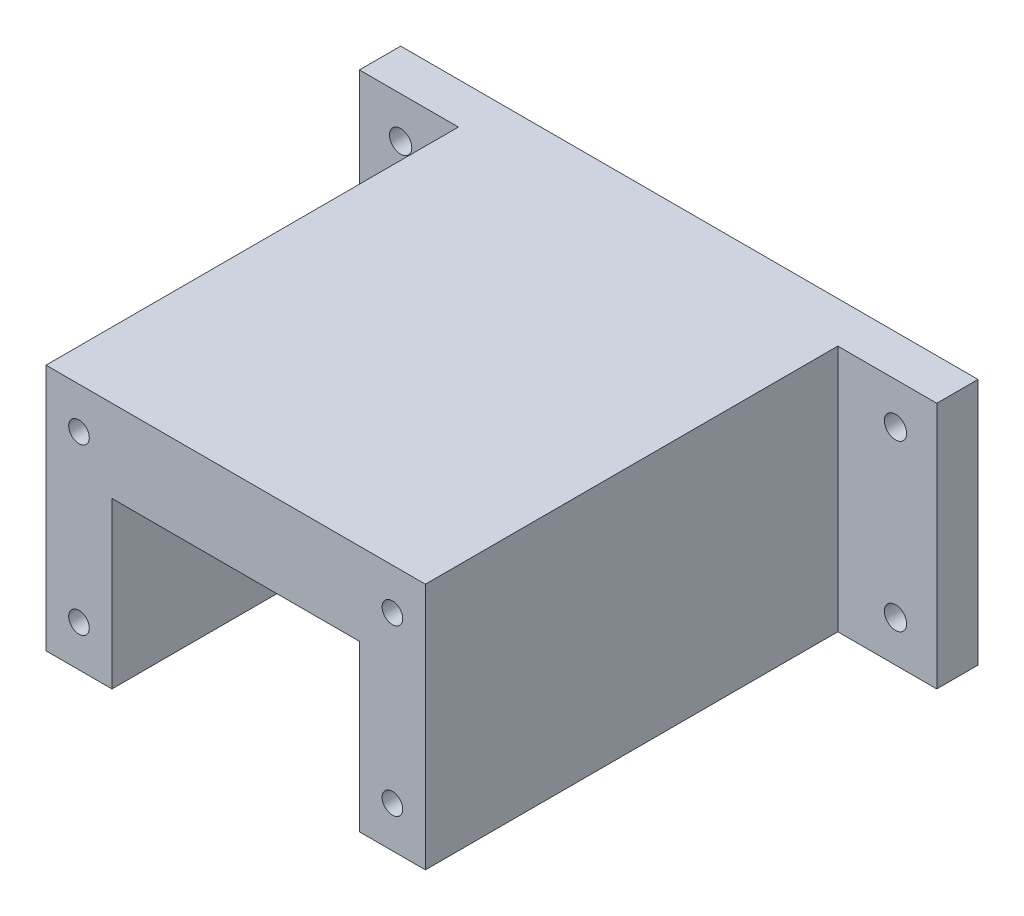
ISO-10303-21;
HEADER;
FILE_DESCRIPTION(('STEP AP214'),'2;1');
FILE_NAME('part.step','',(''),(''),'','','');
FILE_SCHEMA(('AUTOMOTIVE_DESIGN { 1 0 10303 214 1 1 1 1 }'));
ENDSEC;
DATA;
#1=APPLICATION_CONTEXT('core data for automotive mechanical design processes');
#2=APPLICATION_PROTOCOL_DEFINITION('international standard','automotive_design',2000,#1);
#3=PRODUCT_CONTEXT('',#1,'mechanical');
#4=PRODUCT('Part','Part','',(#3));
#5=PRODUCT_RELATED_PRODUCT_CATEGORY('part','',(#4));
#6=PRODUCT_DEFINITION_FORMATION('','',#4);
#7=PRODUCT_DEFINITION_CONTEXT('part definition',#1,'design');
#8=PRODUCT_DEFINITION('design','',#6,#7);
#9=PRODUCT_DEFINITION_SHAPE('','',#8);
#10=(LENGTH_UNIT() NAMED_UNIT(*) SI_UNIT(.MILLI.,.METRE.));
#11=(NAMED_UNIT(*) PLANE_ANGLE_UNIT() SI_UNIT($,.RADIAN.));
#12=(NAMED_UNIT(*) SI_UNIT($,.STERADIAN.) SOLID_ANGLE_UNIT());
#13=UNCERTAINTY_MEASURE_WITH_UNIT(LENGTH_MEASURE(1.E-05),#10,'distance_accuracy_value','');
#14=(GEOMETRIC_REPRESENTATION_CONTEXT(3) GLOBAL_UNCERTAINTY_ASSIGNED_CONTEXT((#13)) GLOBAL_UNIT_ASSIGNED_CONTEXT((#10,
#11,#12)) REPRESENTATION_CONTEXT('',''));
#15=CARTESIAN_POINT('',(0.,0.,0.));
#16=DIRECTION('',(0.,0.,1.));
#17=DIRECTION('',(1.,0.,0.));
#18=AXIS2_PLACEMENT_3D('',#15,#16,#17);
#19=CARTESIAN_POINT('',(0.,0.,5.));
#20=DIRECTION('',(0.,0.,-1.));
#21=DIRECTION('',(-1.,0.,0.));
#22=AXIS2_PLACEMENT_3D('',#19,#20,#21);
#23=PLANE('',#22);
#24=CARTESIAN_POINT('',(5.,5.,5.));
#25=DIRECTION('',(0.,0.,1.));
#26=DIRECTION('',(1.,0.,0.));
#27=AXIS2_PLACEMENT_3D('',#24,#25,#26);
#28=CIRCLE('',#27,1.35);
#29=CARTESIAN_POINT('',(6.35,5.,5.));
#30=VERTEX_POINT('',#29);
#31=EDGE_CURVE('E176',#30,#30,#28,.T.);
#32=ORIENTED_EDGE('',*,*,#31,.F.);
#33=EDGE_LOOP('',(#32));
#34=FACE_BOUND('',#33,.T.);
#35=CARTESIAN_POINT('',(5.,25.,5.));
#36=DIRECTION('',(0.,0.,1.));
#37=DIRECTION('',(1.,0.,0.));
#38=AXIS2_PLACEMENT_3D('',#35,#36,#37);
#39=CIRCLE('',#38,1.35);
#40=CARTESIAN_POINT('',(6.35,25.,5.));
#41=VERTEX_POINT('',#40);
#42=EDGE_CURVE('E182',#41,#41,#39,.T.);
#43=ORIENTED_EDGE('',*,*,#42,.F.);
#44=EDGE_LOOP('',(#43));
#45=FACE_BOUND('',#44,.T.);
#46=DIRECTION('',(0.,-1.,0.));
#47=VECTOR('',#46,1.);
#48=CARTESIAN_POINT('',(12.,0.,5.));
#49=LINE('',#48,#47);
#50=CARTESIAN_POINT('',(12.,30.,5.));
#51=VERTEX_POINT('',#50);
#52=CARTESIAN_POINT('',(12.,0.,5.));
#53=VERTEX_POINT('',#52);
#54=EDGE_CURVE('E153',#51,#53,#49,.T.);
#55=ORIENTED_EDGE('',*,*,#54,.F.);
#56=DIRECTION('',(-1.,0.,0.));
#57=VECTOR('',#56,1.);
#58=CARTESIAN_POINT('',(0.,30.,5.));
#59=LINE('',#58,#57);
#60=CARTESIAN_POINT('',(0.,30.,5.));
#61=VERTEX_POINT('',#60);
#62=EDGE_CURVE('E200',#51,#61,#59,.T.);
#63=ORIENTED_EDGE('',*,*,#62,.T.);
#64=DIRECTION('',(0.,-1.,0.));
#65=VECTOR('',#64,1.);
#66=CARTESIAN_POINT('',(0.,0.,5.));
#67=LINE('',#66,#65);
#68=CARTESIAN_POINT('',(0.,0.,5.));
#69=VERTEX_POINT('',#68);
#70=EDGE_CURVE('E188',#61,#69,#67,.T.);
#71=ORIENTED_EDGE('',*,*,#70,.T.);
#72=DIRECTION('',(1.,0.,0.));
#73=VECTOR('',#72,1.);
#74=CARTESIAN_POINT('',(0.,0.,5.));
#75=LINE('',#74,#73);
#76=EDGE_CURVE('E191',#69,#53,#75,.T.);
#77=ORIENTED_EDGE('',*,*,#76,.T.);
#78=EDGE_LOOP('',(#55,#63,#71,#77));
#79=FACE_BOUND('',#78,.T.);
#80=ADVANCED_FACE('F34',(#34,#45,#79),#23,.F.);
#81=CARTESIAN_POINT('',(65.,5.,5.));
#82=DIRECTION('',(0.,0.,1.));
#83=DIRECTION('',(1.,0.,0.));
#84=AXIS2_PLACEMENT_3D('',#81,#82,#83);
#85=CIRCLE('',#84,1.35000000000001);
#86=CARTESIAN_POINT('',(66.35,5.,5.));
#87=VERTEX_POINT('',#86);
#88=EDGE_CURVE('E160',#87,#87,#85,.T.);
#89=ORIENTED_EDGE('',*,*,#88,.F.);
#90=EDGE_LOOP('',(#89));
#91=FACE_BOUND('',#90,.T.);
#92=CARTESIAN_POINT('',(65.,25.,5.));
#93=DIRECTION('',(0.,0.,1.));
#94=DIRECTION('',(1.,0.,0.));
#95=AXIS2_PLACEMENT_3D('',#92,#93,#94);
#96=CIRCLE('',#95,1.35000000000001);
#97=CARTESIAN_POINT('',(66.35,25.,5.));
#98=VERTEX_POINT('',#97);
#99=EDGE_CURVE('E170',#98,#98,#96,.T.);
#100=ORIENTED_EDGE('',*,*,#99,.F.);
#101=EDGE_LOOP('',(#100));
#102=FACE_BOUND('',#101,.T.);
#103=DIRECTION('',(0.,1.,0.));
#104=VECTOR('',#103,1.);
#105=CARTESIAN_POINT('',(58.,30.,5.));
#106=LINE('',#105,#104);
#107=CARTESIAN_POINT('',(58.,0.,5.));
#108=VERTEX_POINT('',#107);
#109=CARTESIAN_POINT('',(58.,30.,5.));
#110=VERTEX_POINT('',#109);
#111=EDGE_CURVE('E283',#108,#110,#106,.T.);
#112=ORIENTED_EDGE('',*,*,#111,.F.);
#113=DIRECTION('',(1.,0.,0.));
#114=VECTOR('',#113,1.);
#115=CARTESIAN_POINT('',(50.,0.,5.));
#116=LINE('',#115,#114);
#117=CARTESIAN_POINT('',(70.,0.,5.));
#118=VERTEX_POINT('',#117);
#119=EDGE_CURVE('E196',#108,#118,#116,.T.);
#120=ORIENTED_EDGE('',*,*,#119,.T.);
#121=DIRECTION('',(0.,1.,0.));
#122=VECTOR('',#121,1.);
#123=CARTESIAN_POINT('',(70.,0.,5.));
#124=LINE('',#123,#122);
#125=CARTESIAN_POINT('',(70.,30.,5.));
#126=VERTEX_POINT('',#125);
#127=EDGE_CURVE('E198',#118,#126,#124,.T.);
#128=ORIENTED_EDGE('',*,*,#127,.T.);
#129=EDGE_CURVE('E201',#126,#110,#59,.T.);
#130=ORIENTED_EDGE('',*,*,#129,.T.);
#131=EDGE_LOOP('',(#112,#120,#128,#130));
#132=FACE_BOUND('',#131,.T.);
#133=ADVANCED_FACE('F335',(#91,#102,#132),#23,.F.);
#134=DIRECTION('',(0.,1.,0.));
#135=VECTOR('',#134,1.);
#136=CARTESIAN_POINT('',(20.,20.,5.));
#137=LINE('',#136,#135);
#138=CARTESIAN_POINT('',(20.,10.,5.));
#139=VERTEX_POINT('',#138);
#140=CARTESIAN_POINT('',(20.,20.,5.));
#141=VERTEX_POINT('',#140);
#142=EDGE_CURVE('E11',#139,#141,#137,.T.);
#143=ORIENTED_EDGE('',*,*,#142,.F.);
#144=DIRECTION('',(1.,0.,0.));
#145=VECTOR('',#144,1.);
#146=CARTESIAN_POINT('',(20.,10.,5.));
#147=LINE('',#146,#145);
#148=CARTESIAN_POINT('',(50.,10.,5.));
#149=VERTEX_POINT('',#148);
#150=EDGE_CURVE('E194',#139,#149,#147,.T.);
#151=ORIENTED_EDGE('',*,*,#150,.T.);
#152=DIRECTION('',(0.,-1.,0.));
#153=VECTOR('',#152,1.);
#154=CARTESIAN_POINT('',(50.,0.,5.));
#155=LINE('',#154,#153);
#156=CARTESIAN_POINT('',(50.,20.,5.));
#157=VERTEX_POINT('',#156);
#158=EDGE_CURVE('E54',#157,#149,#155,.T.);
#159=ORIENTED_EDGE('',*,*,#158,.F.);
#160=DIRECTION('',(1.,0.,0.));
#161=VECTOR('',#160,1.);
#162=CARTESIAN_POINT('',(50.,20.,5.));
#163=LINE('',#162,#161);
#164=EDGE_CURVE('E50',#141,#157,#163,.T.);
#165=ORIENTED_EDGE('',*,*,#164,.F.);
#166=EDGE_LOOP('',(#143,#151,#159,#165));
#167=FACE_BOUND('',#166,.T.);
#168=ADVANCED_FACE('F259',(#167),#23,.F.);
#169=CARTESIAN_POINT('',(0.,0.,0.));
#170=DIRECTION('',(0.,0.,-1.));
#171=DIRECTION('',(-1.,0.,0.));
#172=AXIS2_PLACEMENT_3D('',#169,#170,#171);
#173=PLANE('',#172);
#174=CARTESIAN_POINT('',(65.,25.,0.));
#175=DIRECTION('',(0.,0.,1.));
#176=DIRECTION('',(1.,0.,0.));
#177=AXIS2_PLACEMENT_3D('',#174,#175,#176);
#178=CIRCLE('',#177,1.35000000000001);
#179=CARTESIAN_POINT('',(66.35,25.,0.));
#180=VERTEX_POINT('',#179);
#181=EDGE_CURVE('E168',#180,#180,#178,.T.);
#182=ORIENTED_EDGE('',*,*,#181,.T.);
#183=EDGE_LOOP('',(#182));
#184=FACE_BOUND('',#183,.T.);
#185=CARTESIAN_POINT('',(5.,25.,0.));
#186=DIRECTION('',(0.,0.,1.));
#187=DIRECTION('',(1.,0.,0.));
#188=AXIS2_PLACEMENT_3D('',#185,#186,#187);
#189=CIRCLE('',#188,1.35);
#190=CARTESIAN_POINT('',(6.35,25.,0.));
#191=VERTEX_POINT('',#190);
#192=EDGE_CURVE('E179',#191,#191,#189,.T.);
#193=ORIENTED_EDGE('',*,*,#192,.T.);
#194=EDGE_LOOP('',(#193));
#195=FACE_BOUND('',#194,.T.);
#196=DIRECTION('',(0.,-1.,0.));
#197=VECTOR('',#196,1.);
#198=CARTESIAN_POINT('',(0.,0.,0.));
#199=LINE('',#198,#197);
#200=CARTESIAN_POINT('',(0.,30.,0.));
#201=VERTEX_POINT('',#200);
#202=CARTESIAN_POINT('',(0.,0.,0.));
#203=VERTEX_POINT('',#202);
#204=EDGE_CURVE('E185',#201,#203,#199,.T.);
#205=ORIENTED_EDGE('',*,*,#204,.F.);
#206=DIRECTION('',(-1.,0.,0.));
#207=VECTOR('',#206,1.);
#208=CARTESIAN_POINT('',(0.,30.,0.));
#209=LINE('',#208,#207);
#210=CARTESIAN_POINT('',(70.,30.,0.));
#211=VERTEX_POINT('',#210);
#212=EDGE_CURVE('E192',#211,#201,#209,.T.);
#213=ORIENTED_EDGE('',*,*,#212,.F.);
#214=DIRECTION('',(0.,1.,0.));
#215=VECTOR('',#214,1.);
#216=CARTESIAN_POINT('',(70.,0.,0.));
#217=LINE('',#216,#215);
#218=CARTESIAN_POINT('',(70.,0.,0.));
#219=VERTEX_POINT('',#218);
#220=EDGE_CURVE('E216',#219,#211,#217,.T.);
#221=ORIENTED_EDGE('',*,*,#220,.F.);
#222=DIRECTION('',(1.,0.,0.));
#223=VECTOR('',#222,1.);
#224=CARTESIAN_POINT('',(50.,0.,0.));
#225=LINE('',#224,#223);
#226=CARTESIAN_POINT('',(50.,0.,0.));
#227=VERTEX_POINT('',#226);
#228=EDGE_CURVE('E214',#227,#219,#225,.T.);
#229=ORIENTED_EDGE('',*,*,#228,.F.);
#230=DIRECTION('',(0.,-1.,0.));
#231=VECTOR('',#230,1.);
#232=CARTESIAN_POINT('',(50.,10.,0.));
#233=LINE('',#232,#231);
#234=CARTESIAN_POINT('',(50.,10.,0.));
#235=VERTEX_POINT('',#234);
#236=EDGE_CURVE('E212',#235,#227,#233,.T.);
#237=ORIENTED_EDGE('',*,*,#236,.F.);
#238=DIRECTION('',(1.,0.,0.));
#239=VECTOR('',#238,1.);
#240=CARTESIAN_POINT('',(20.,10.,0.));
#241=LINE('',#240,#239);
#242=CARTESIAN_POINT('',(20.,10.,0.));
#243=VERTEX_POINT('',#242);
#244=EDGE_CURVE('E210',#243,#235,#241,.T.);
#245=ORIENTED_EDGE('',*,*,#244,.F.);
#246=DIRECTION('',(0.,1.,0.));
#247=VECTOR('',#246,1.);
#248=CARTESIAN_POINT('',(20.,0.,0.));
#249=LINE('',#248,#247);
#250=CARTESIAN_POINT('',(20.,0.,0.));
#251=VERTEX_POINT('',#250);
#252=EDGE_CURVE('E208',#251,#243,#249,.T.);
#253=ORIENTED_EDGE('',*,*,#252,.F.);
#254=DIRECTION('',(1.,0.,0.));
#255=VECTOR('',#254,1.);
#256=CARTESIAN_POINT('',(0.,0.,0.));
#257=LINE('',#256,#255);
#258=EDGE_CURVE('E206',#203,#251,#257,.T.);
#259=ORIENTED_EDGE('',*,*,#258,.F.);
#260=EDGE_LOOP('',(#205,#213,#221,#229,#237,#245,#253,#259));
#261=FACE_BOUND('',#260,.T.);
#262=CARTESIAN_POINT('',(5.,5.,0.));
#263=DIRECTION('',(0.,0.,1.));
#264=DIRECTION('',(1.,0.,0.));
#265=AXIS2_PLACEMENT_3D('',#262,#263,#264);
#266=CIRCLE('',#265,1.35);
#267=CARTESIAN_POINT('',(6.35,5.,0.));
#268=VERTEX_POINT('',#267);
#269=EDGE_CURVE('E173',#268,#268,#266,.T.);
#270=ORIENTED_EDGE('',*,*,#269,.T.);
#271=EDGE_LOOP('',(#270));
#272=FACE_BOUND('',#271,.T.);
#273=CARTESIAN_POINT('',(65.,5.,0.));
#274=DIRECTION('',(0.,0.,1.));
#275=DIRECTION('',(1.,0.,0.));
#276=AXIS2_PLACEMENT_3D('',#273,#274,#275);
#277=CIRCLE('',#276,1.35000000000001);
#278=CARTESIAN_POINT('',(66.35,5.,0.));
#279=VERTEX_POINT('',#278);
#280=EDGE_CURVE('E156',#279,#279,#277,.T.);
#281=ORIENTED_EDGE('',*,*,#280,.T.);
#282=EDGE_LOOP('',(#281));
#283=FACE_BOUND('',#282,.T.);
#284=ADVANCED_FACE('F248',(#184,#195,#261,#272,#283),#173,.T.);
#285=CARTESIAN_POINT('',(0.,0.,5.));
#286=DIRECTION('',(1.,0.,0.));
#287=DIRECTION('',(0.,0.,-1.));
#288=AXIS2_PLACEMENT_3D('',#285,#286,#287);
#289=PLANE('',#288);
#290=ORIENTED_EDGE('',*,*,#204,.T.);
#291=DIRECTION('',(0.,0.,-1.));
#292=VECTOR('',#291,1.);
#293=CARTESIAN_POINT('',(0.,0.,5.));
#294=LINE('',#293,#292);
#295=EDGE_CURVE('E38',#69,#203,#294,.T.);
#296=ORIENTED_EDGE('',*,*,#295,.F.);
#297=ORIENTED_EDGE('',*,*,#70,.F.);
#298=DIRECTION('',(0.,0.,-1.));
#299=VECTOR('',#298,1.);
#300=CARTESIAN_POINT('',(0.,30.,5.));
#301=LINE('',#300,#299);
#302=EDGE_CURVE('E203',#61,#201,#301,.T.);
#303=ORIENTED_EDGE('',*,*,#302,.T.);
#304=EDGE_LOOP('',(#290,#296,#297,#303));
#305=FACE_BOUND('',#304,.T.);
#306=ADVANCED_FACE('F36',(#305),#289,.F.);
#307=CARTESIAN_POINT('',(0.,0.,5.));
#308=DIRECTION('',(0.,1.,0.));
#309=DIRECTION('',(0.,0.,1.));
#310=AXIS2_PLACEMENT_3D('',#307,#308,#309);
#311=PLANE('',#310);
#312=ORIENTED_EDGE('',*,*,#258,.T.);
#313=DIRECTION('',(0.,0.,-1.));
#314=VECTOR('',#313,1.);
#315=CARTESIAN_POINT('',(20.,0.,5.));
#316=LINE('',#315,#314);
#317=CARTESIAN_POINT('',(20.,0.,55.));
#318=VERTEX_POINT('',#317);
#319=EDGE_CURVE('E233',#318,#251,#316,.T.);
#320=ORIENTED_EDGE('',*,*,#319,.F.);
#321=DIRECTION('',(1.,0.,0.));
#322=VECTOR('',#321,1.);
#323=CARTESIAN_POINT('',(20.,0.,55.));
#324=LINE('',#323,#322);
#325=CARTESIAN_POINT('',(12.,0.,55.));
#326=VERTEX_POINT('',#325);
#327=EDGE_CURVE('E265',#326,#318,#324,.T.);
#328=ORIENTED_EDGE('',*,*,#327,.F.);
#329=DIRECTION('',(0.,0.,-1.));
#330=VECTOR('',#329,1.);
#331=CARTESIAN_POINT('',(12.,0.,55.));
#332=LINE('',#331,#330);
#333=EDGE_CURVE('E261',#326,#53,#332,.T.);
#334=ORIENTED_EDGE('',*,*,#333,.T.);
#335=ORIENTED_EDGE('',*,*,#76,.F.);
#336=ORIENTED_EDGE('',*,*,#295,.T.);
#337=EDGE_LOOP('',(#312,#320,#328,#334,#335,#336));
#338=FACE_BOUND('',#337,.T.);
#339=ADVANCED_FACE('F240',(#338),#311,.F.);
#340=CARTESIAN_POINT('',(20.,0.,5.));
#341=DIRECTION('',(-1.,0.,0.));
#342=DIRECTION('',(0.,-1.,0.));
#343=AXIS2_PLACEMENT_3D('',#340,#341,#342);
#344=PLANE('',#343);
#345=ORIENTED_EDGE('',*,*,#252,.T.);
#346=DIRECTION('',(0.,0.,-1.));
#347=VECTOR('',#346,1.);
#348=CARTESIAN_POINT('',(20.,10.,5.));
#349=LINE('',#348,#347);
#350=EDGE_CURVE('E231',#139,#243,#349,.T.);
#351=ORIENTED_EDGE('',*,*,#350,.F.);
#352=ORIENTED_EDGE('',*,*,#142,.T.);
#353=DIRECTION('',(0.,0.,-1.));
#354=VECTOR('',#353,1.);
#355=CARTESIAN_POINT('',(20.,20.,55.));
#356=LINE('',#355,#354);
#357=CARTESIAN_POINT('',(20.,20.,55.));
#358=VERTEX_POINT('',#357);
#359=EDGE_CURVE('E260',#358,#141,#356,.T.);
#360=ORIENTED_EDGE('',*,*,#359,.F.);
#361=DIRECTION('',(0.,1.,0.));
#362=VECTOR('',#361,1.);
#363=CARTESIAN_POINT('',(20.,20.,55.));
#364=LINE('',#363,#362);
#365=EDGE_CURVE('E149',#318,#358,#364,.T.);
#366=ORIENTED_EDGE('',*,*,#365,.F.);
#367=ORIENTED_EDGE('',*,*,#319,.T.);
#368=EDGE_LOOP('',(#345,#351,#352,#360,#366,#367));
#369=FACE_BOUND('',#368,.T.);
#370=ADVANCED_FACE('F254',(#369),#344,.F.);
#371=CARTESIAN_POINT('',(20.,10.,5.));
#372=DIRECTION('',(0.,1.,0.));
#373=DIRECTION('',(0.,0.,1.));
#374=AXIS2_PLACEMENT_3D('',#371,#372,#373);
#375=PLANE('',#374);
#376=ORIENTED_EDGE('',*,*,#244,.T.);
#377=DIRECTION('',(0.,0.,-1.));
#378=VECTOR('',#377,1.);
#379=CARTESIAN_POINT('',(50.,10.,5.));
#380=LINE('',#379,#378);
#381=EDGE_CURVE('E228',#149,#235,#380,.T.);
#382=ORIENTED_EDGE('',*,*,#381,.F.);
#383=ORIENTED_EDGE('',*,*,#150,.F.);
#384=ORIENTED_EDGE('',*,*,#350,.T.);
#385=EDGE_LOOP('',(#376,#382,#383,#384));
#386=FACE_BOUND('',#385,.T.);
#387=ADVANCED_FACE('F257',(#386),#375,.F.);
#388=CARTESIAN_POINT('',(50.,10.,5.));
#389=DIRECTION('',(1.,0.,0.));
#390=DIRECTION('',(0.,0.,-1.));
#391=AXIS2_PLACEMENT_3D('',#388,#389,#390);
#392=PLANE('',#391);
#393=ORIENTED_EDGE('',*,*,#236,.T.);
#394=DIRECTION('',(0.,0.,-1.));
#395=VECTOR('',#394,1.);
#396=CARTESIAN_POINT('',(50.,0.,5.));
#397=LINE('',#396,#395);
#398=CARTESIAN_POINT('',(50.,0.,55.));
#399=VERTEX_POINT('',#398);
#400=EDGE_CURVE('E139',#399,#227,#397,.T.);
#401=ORIENTED_EDGE('',*,*,#400,.F.);
#402=DIRECTION('',(0.,-1.,0.));
#403=VECTOR('',#402,1.);
#404=CARTESIAN_POINT('',(50.,0.,55.));
#405=LINE('',#404,#403);
#406=CARTESIAN_POINT('',(50.,20.,55.));
#407=VERTEX_POINT('',#406);
#408=EDGE_CURVE('E133',#407,#399,#405,.T.);
#409=ORIENTED_EDGE('',*,*,#408,.F.);
#410=DIRECTION('',(0.,0.,-1.));
#411=VECTOR('',#410,1.);
#412=CARTESIAN_POINT('',(50.,20.,55.));
#413=LINE('',#412,#411);
#414=EDGE_CURVE('E137',#407,#157,#413,.T.);
#415=ORIENTED_EDGE('',*,*,#414,.T.);
#416=ORIENTED_EDGE('',*,*,#158,.T.);
#417=ORIENTED_EDGE('',*,*,#381,.T.);
#418=EDGE_LOOP('',(#393,#401,#409,#415,#416,#417));
#419=FACE_BOUND('',#418,.T.);
#420=ADVANCED_FACE('F135',(#419),#392,.F.);
#421=CARTESIAN_POINT('',(50.,0.,5.));
#422=DIRECTION('',(0.,1.,0.));
#423=DIRECTION('',(0.,0.,1.));
#424=AXIS2_PLACEMENT_3D('',#421,#422,#423);
#425=PLANE('',#424);
#426=ORIENTED_EDGE('',*,*,#228,.T.);
#427=DIRECTION('',(0.,0.,-1.));
#428=VECTOR('',#427,1.);
#429=CARTESIAN_POINT('',(70.,0.,5.));
#430=LINE('',#429,#428);
#431=EDGE_CURVE('E224',#118,#219,#430,.T.);
#432=ORIENTED_EDGE('',*,*,#431,.F.);
#433=ORIENTED_EDGE('',*,*,#119,.F.);
#434=DIRECTION('',(0.,0.,-1.));
#435=VECTOR('',#434,1.);
#436=CARTESIAN_POINT('',(58.,0.,55.));
#437=LINE('',#436,#435);
#438=CARTESIAN_POINT('',(58.,0.,55.));
#439=VERTEX_POINT('',#438);
#440=EDGE_CURVE('E157',#439,#108,#437,.T.);
#441=ORIENTED_EDGE('',*,*,#440,.F.);
#442=DIRECTION('',(1.,0.,0.));
#443=VECTOR('',#442,1.);
#444=CARTESIAN_POINT('',(58.,0.,55.));
#445=LINE('',#444,#443);
#446=EDGE_CURVE('E142',#399,#439,#445,.T.);
#447=ORIENTED_EDGE('',*,*,#446,.F.);
#448=ORIENTED_EDGE('',*,*,#400,.T.);
#449=EDGE_LOOP('',(#426,#432,#433,#441,#447,#448));
#450=FACE_BOUND('',#449,.T.);
#451=ADVANCED_FACE('F362',(#450),#425,.F.);
#452=CARTESIAN_POINT('',(70.,0.,5.));
#453=DIRECTION('',(-1.,0.,0.));
#454=DIRECTION('',(0.,0.,1.));
#455=AXIS2_PLACEMENT_3D('',#452,#453,#454);
#456=PLANE('',#455);
#457=ORIENTED_EDGE('',*,*,#220,.T.);
#458=DIRECTION('',(0.,0.,-1.));
#459=VECTOR('',#458,1.);
#460=CARTESIAN_POINT('',(70.,30.,5.));
#461=LINE('',#460,#459);
#462=EDGE_CURVE('E221',#126,#211,#461,.T.);
#463=ORIENTED_EDGE('',*,*,#462,.F.);
#464=ORIENTED_EDGE('',*,*,#127,.F.);
#465=ORIENTED_EDGE('',*,*,#431,.T.);
#466=EDGE_LOOP('',(#457,#463,#464,#465));
#467=FACE_BOUND('',#466,.T.);
#468=ADVANCED_FACE('F359',(#467),#456,.F.);
#469=CARTESIAN_POINT('',(0.,30.,5.));
#470=DIRECTION('',(0.,-1.,0.));
#471=DIRECTION('',(0.,0.,-1.));
#472=AXIS2_PLACEMENT_3D('',#469,#470,#471);
#473=PLANE('',#472);
#474=ORIENTED_EDGE('',*,*,#212,.T.);
#475=ORIENTED_EDGE('',*,*,#302,.F.);
#476=ORIENTED_EDGE('',*,*,#62,.F.);
#477=DIRECTION('',(0.,0.,-1.));
#478=VECTOR('',#477,1.);
#479=CARTESIAN_POINT('',(12.,30.,55.));
#480=LINE('',#479,#478);
#481=CARTESIAN_POINT('',(12.,30.,55.));
#482=VERTEX_POINT('',#481);
#483=EDGE_CURVE('E263',#482,#51,#480,.T.);
#484=ORIENTED_EDGE('',*,*,#483,.F.);
#485=DIRECTION('',(-1.,0.,0.));
#486=VECTOR('',#485,1.);
#487=CARTESIAN_POINT('',(12.,30.,55.));
#488=LINE('',#487,#486);
#489=CARTESIAN_POINT('',(58.,30.,55.));
#490=VERTEX_POINT('',#489);
#491=EDGE_CURVE('E277',#490,#482,#488,.T.);
#492=ORIENTED_EDGE('',*,*,#491,.F.);
#493=DIRECTION('',(0.,0.,-1.));
#494=VECTOR('',#493,1.);
#495=CARTESIAN_POINT('',(58.,30.,55.));
#496=LINE('',#495,#494);
#497=EDGE_CURVE('E163',#490,#110,#496,.T.);
#498=ORIENTED_EDGE('',*,*,#497,.T.);
#499=ORIENTED_EDGE('',*,*,#129,.F.);
#500=ORIENTED_EDGE('',*,*,#462,.T.);
#501=EDGE_LOOP('',(#474,#475,#476,#484,#492,#498,#499,#500));
#502=FACE_BOUND('',#501,.T.);
#503=ADVANCED_FACE('F275',(#502),#473,.F.);
#504=CARTESIAN_POINT('',(5.,25.,5.));
#505=DIRECTION('',(0.,0.,-1.));
#506=DIRECTION('',(-1.,0.,0.));
#507=AXIS2_PLACEMENT_3D('',#504,#505,#506);
#508=CYLINDRICAL_SURFACE('',#507,1.35);
#509=ORIENTED_EDGE('',*,*,#42,.T.);
#510=EDGE_LOOP('',(#509));
#511=FACE_BOUND('',#510,.T.);
#512=ORIENTED_EDGE('',*,*,#192,.F.);
#513=EDGE_LOOP('',(#512));
#514=FACE_BOUND('',#513,.T.);
#515=ADVANCED_FACE('F358',(#511,#514),#508,.F.);
#516=CARTESIAN_POINT('',(5.,5.,5.));
#517=DIRECTION('',(0.,0.,-1.));
#518=DIRECTION('',(-1.,0.,0.));
#519=AXIS2_PLACEMENT_3D('',#516,#517,#518);
#520=CYLINDRICAL_SURFACE('',#519,1.35);
#521=ORIENTED_EDGE('',*,*,#31,.T.);
#522=EDGE_LOOP('',(#521));
#523=FACE_BOUND('',#522,.T.);
#524=ORIENTED_EDGE('',*,*,#269,.F.);
#525=EDGE_LOOP('',(#524));
#526=FACE_BOUND('',#525,.T.);
#527=ADVANCED_FACE('F408',(#523,#526),#520,.F.);
#528=CARTESIAN_POINT('',(65.,25.,5.));
#529=DIRECTION('',(0.,0.,-1.));
#530=DIRECTION('',(-1.,0.,0.));
#531=AXIS2_PLACEMENT_3D('',#528,#529,#530);
#532=CYLINDRICAL_SURFACE('',#531,1.35000000000001);
#533=ORIENTED_EDGE('',*,*,#99,.T.);
#534=EDGE_LOOP('',(#533));
#535=FACE_BOUND('',#534,.T.);
#536=ORIENTED_EDGE('',*,*,#181,.F.);
#537=EDGE_LOOP('',(#536));
#538=FACE_BOUND('',#537,.T.);
#539=ADVANCED_FACE('F415',(#535,#538),#532,.F.);
#540=CARTESIAN_POINT('',(65.,5.,5.));
#541=DIRECTION('',(0.,0.,-1.));
#542=DIRECTION('',(-1.,0.,0.));
#543=AXIS2_PLACEMENT_3D('',#540,#541,#542);
#544=CYLINDRICAL_SURFACE('',#543,1.35000000000001);
#545=ORIENTED_EDGE('',*,*,#88,.T.);
#546=EDGE_LOOP('',(#545));
#547=FACE_BOUND('',#546,.T.);
#548=ORIENTED_EDGE('',*,*,#280,.F.);
#549=EDGE_LOOP('',(#548));
#550=FACE_BOUND('',#549,.T.);
#551=ADVANCED_FACE('F423',(#547,#550),#544,.F.);
#552=CARTESIAN_POINT('',(50.,20.,55.));
#553=DIRECTION('',(0.,1.,0.));
#554=DIRECTION('',(-1.,0.,0.));
#555=AXIS2_PLACEMENT_3D('',#552,#553,#554);
#556=PLANE('',#555);
#557=ORIENTED_EDGE('',*,*,#164,.T.);
#558=ORIENTED_EDGE('',*,*,#414,.F.);
#559=DIRECTION('',(1.,0.,0.));
#560=VECTOR('',#559,1.);
#561=CARTESIAN_POINT('',(50.,20.,55.));
#562=LINE('',#561,#560);
#563=EDGE_CURVE('E143',#358,#407,#562,.T.);
#564=ORIENTED_EDGE('',*,*,#563,.F.);
#565=ORIENTED_EDGE('',*,*,#359,.T.);
#566=EDGE_LOOP('',(#557,#558,#564,#565));
#567=FACE_BOUND('',#566,.T.);
#568=ADVANCED_FACE('F155',(#567),#556,.F.);
#569=CARTESIAN_POINT('',(58.,30.,55.));
#570=DIRECTION('',(-1.,0.,0.));
#571=DIRECTION('',(0.,-1.,0.));
#572=AXIS2_PLACEMENT_3D('',#569,#570,#571);
#573=PLANE('',#572);
#574=ORIENTED_EDGE('',*,*,#111,.T.);
#575=ORIENTED_EDGE('',*,*,#497,.F.);
#576=DIRECTION('',(0.,1.,0.));
#577=VECTOR('',#576,1.);
#578=CARTESIAN_POINT('',(58.,30.,55.));
#579=LINE('',#578,#577);
#580=EDGE_CURVE('E282',#439,#490,#579,.T.);
#581=ORIENTED_EDGE('',*,*,#580,.F.);
#582=ORIENTED_EDGE('',*,*,#440,.T.);
#583=EDGE_LOOP('',(#574,#575,#581,#582));
#584=FACE_BOUND('',#583,.T.);
#585=ADVANCED_FACE('F281',(#584),#573,.F.);
#586=CARTESIAN_POINT('',(12.,0.,55.));
#587=DIRECTION('',(1.,0.,0.));
#588=DIRECTION('',(0.,0.,-1.));
#589=AXIS2_PLACEMENT_3D('',#586,#587,#588);
#590=PLANE('',#589);
#591=ORIENTED_EDGE('',*,*,#54,.T.);
#592=ORIENTED_EDGE('',*,*,#333,.F.);
#593=DIRECTION('',(0.,-1.,0.));
#594=VECTOR('',#593,1.);
#595=CARTESIAN_POINT('',(12.,0.,55.));
#596=LINE('',#595,#594);
#597=EDGE_CURVE('E294',#482,#326,#596,.T.);
#598=ORIENTED_EDGE('',*,*,#597,.F.);
#599=ORIENTED_EDGE('',*,*,#483,.T.);
#600=EDGE_LOOP('',(#591,#592,#598,#599));
#601=FACE_BOUND('',#600,.T.);
#602=ADVANCED_FACE('F443',(#601),#590,.F.);
#603=CARTESIAN_POINT('',(0.,0.,55.));
#604=DIRECTION('',(0.,0.,1.));
#605=DIRECTION('',(1.,0.,0.));
#606=AXIS2_PLACEMENT_3D('',#603,#604,#605);
#607=PLANE('',#606);
#608=CARTESIAN_POINT('',(16.,4.99999999999999,55.));
#609=DIRECTION('',(0.,0.,-1.));
#610=DIRECTION('',(1.,0.,0.));
#611=AXIS2_PLACEMENT_3D('',#608,#609,#610);
#612=CIRCLE('',#611,1.25);
#613=CARTESIAN_POINT('',(17.25,4.99999999999999,55.));
#614=VERTEX_POINT('',#613);
#615=EDGE_CURVE('E317',#614,#614,#612,.T.);
#616=ORIENTED_EDGE('',*,*,#615,.T.);
#617=EDGE_LOOP('',(#616));
#618=FACE_BOUND('',#617,.T.);
#619=CARTESIAN_POINT('',(54.,4.99999999999999,55.));
#620=DIRECTION('',(0.,0.,1.));
#621=DIRECTION('',(-1.,0.,0.));
#622=AXIS2_PLACEMENT_3D('',#619,#620,#621);
#623=CIRCLE('',#622,1.25);
#624=CARTESIAN_POINT('',(52.75,4.99999999999999,55.));
#625=VERTEX_POINT('',#624);
#626=EDGE_CURVE('E311',#625,#625,#623,.T.);
#627=ORIENTED_EDGE('',*,*,#626,.F.);
#628=EDGE_LOOP('',(#627));
#629=FACE_BOUND('',#628,.T.);
#630=CARTESIAN_POINT('',(54.,25.,55.));
#631=DIRECTION('',(0.,0.,-1.));
#632=DIRECTION('',(-1.,0.,0.));
#633=AXIS2_PLACEMENT_3D('',#630,#631,#632);
#634=CIRCLE('',#633,1.25);
#635=CARTESIAN_POINT('',(52.75,25.,55.));
#636=VERTEX_POINT('',#635);
#637=EDGE_CURVE('E305',#636,#636,#634,.T.);
#638=ORIENTED_EDGE('',*,*,#637,.T.);
#639=EDGE_LOOP('',(#638));
#640=FACE_BOUND('',#639,.T.);
#641=CARTESIAN_POINT('',(16.,25.,55.));
#642=DIRECTION('',(0.,0.,1.));
#643=DIRECTION('',(1.,0.,0.));
#644=AXIS2_PLACEMENT_3D('',#641,#642,#643);
#645=CIRCLE('',#644,1.25);
#646=CARTESIAN_POINT('',(17.25,25.,55.));
#647=VERTEX_POINT('',#646);
#648=EDGE_CURVE('E299',#647,#647,#645,.T.);
#649=ORIENTED_EDGE('',*,*,#648,.F.);
#650=EDGE_LOOP('',(#649));
#651=FACE_BOUND('',#650,.T.);
#652=ORIENTED_EDGE('',*,*,#563,.T.);
#653=ORIENTED_EDGE('',*,*,#408,.T.);
#654=ORIENTED_EDGE('',*,*,#446,.T.);
#655=ORIENTED_EDGE('',*,*,#580,.T.);
#656=ORIENTED_EDGE('',*,*,#491,.T.);
#657=ORIENTED_EDGE('',*,*,#597,.T.);
#658=ORIENTED_EDGE('',*,*,#327,.T.);
#659=ORIENTED_EDGE('',*,*,#365,.T.);
#660=EDGE_LOOP('',(#652,#653,#654,#655,#656,#657,#658,#659));
#661=FACE_BOUND('',#660,.T.);
#662=ADVANCED_FACE('F146',(#618,#629,#640,#651,#661),#607,.T.);
#663=CARTESIAN_POINT('',(16.,25.,45.));
#664=DIRECTION('',(0.,0.,1.));
#665=DIRECTION('',(1.,0.,0.));
#666=AXIS2_PLACEMENT_3D('',#663,#664,#665);
#667=CYLINDRICAL_SURFACE('',#666,1.25);
#668=CARTESIAN_POINT('',(16.,25.,45.));
#669=DIRECTION('',(0.,0.,1.));
#670=DIRECTION('',(1.,0.,0.));
#671=AXIS2_PLACEMENT_3D('',#668,#669,#670);
#672=CIRCLE('',#671,1.25);
#673=CARTESIAN_POINT('',(17.25,25.,45.));
#674=VERTEX_POINT('',#673);
#675=EDGE_CURVE('E291',#674,#674,#672,.T.);
#676=ORIENTED_EDGE('',*,*,#675,.F.);
#677=EDGE_LOOP('',(#676));
#678=FACE_BOUND('',#677,.T.);
#679=ORIENTED_EDGE('',*,*,#648,.T.);
#680=EDGE_LOOP('',(#679));
#681=FACE_BOUND('',#680,.T.);
#682=ADVANCED_FACE('F458',(#678,#681),#667,.F.);
#683=CARTESIAN_POINT('',(16.,25.,45.));
#684=DIRECTION('',(0.,0.,1.));
#685=DIRECTION('',(1.,0.,0.));
#686=AXIS2_PLACEMENT_3D('',#683,#684,#685);
#687=PLANE('',#686);
#688=ORIENTED_EDGE('',*,*,#675,.T.);
#689=EDGE_LOOP('',(#688));
#690=FACE_BOUND('',#689,.T.);
#691=ADVANCED_FACE('F467',(#690),#687,.T.);
#692=CARTESIAN_POINT('',(54.,25.,45.));
#693=DIRECTION('',(0.,0.,1.));
#694=DIRECTION('',(1.,0.,0.));
#695=AXIS2_PLACEMENT_3D('',#692,#693,#694);
#696=CYLINDRICAL_SURFACE('',#695,1.25);
#697=CARTESIAN_POINT('',(54.,25.,45.));
#698=DIRECTION('',(0.,0.,-1.));
#699=DIRECTION('',(-1.,0.,0.));
#700=AXIS2_PLACEMENT_3D('',#697,#698,#699);
#701=CIRCLE('',#700,1.25);
#702=CARTESIAN_POINT('',(52.75,25.,45.));
#703=VERTEX_POINT('',#702);
#704=EDGE_CURVE('E302',#703,#703,#701,.T.);
#705=ORIENTED_EDGE('',*,*,#704,.T.);
#706=EDGE_LOOP('',(#705));
#707=FACE_BOUND('',#706,.T.);
#708=ORIENTED_EDGE('',*,*,#637,.F.);
#709=EDGE_LOOP('',(#708));
#710=FACE_BOUND('',#709,.T.);
#711=ADVANCED_FACE('F475',(#707,#710),#696,.F.);
#712=CARTESIAN_POINT('',(54.,25.,45.));
#713=DIRECTION('',(0.,0.,1.));
#714=DIRECTION('',(-1.,0.,0.));
#715=AXIS2_PLACEMENT_3D('',#712,#713,#714);
#716=PLANE('',#715);
#717=ORIENTED_EDGE('',*,*,#704,.F.);
#718=EDGE_LOOP('',(#717));
#719=FACE_BOUND('',#718,.T.);
#720=ADVANCED_FACE('F483',(#719),#716,.T.);
#721=CARTESIAN_POINT('',(54.,4.99999999999999,45.));
#722=DIRECTION('',(0.,0.,1.));
#723=DIRECTION('',(1.,0.,0.));
#724=AXIS2_PLACEMENT_3D('',#721,#722,#723);
#725=CYLINDRICAL_SURFACE('',#724,1.25);
#726=CARTESIAN_POINT('',(54.,4.99999999999999,45.));
#727=DIRECTION('',(0.,0.,1.));
#728=DIRECTION('',(-1.,0.,0.));
#729=AXIS2_PLACEMENT_3D('',#726,#727,#728);
#730=CIRCLE('',#729,1.25);
#731=CARTESIAN_POINT('',(52.75,4.99999999999999,45.));
#732=VERTEX_POINT('',#731);
#733=EDGE_CURVE('E308',#732,#732,#730,.T.);
#734=ORIENTED_EDGE('',*,*,#733,.F.);
#735=EDGE_LOOP('',(#734));
#736=FACE_BOUND('',#735,.T.);
#737=ORIENTED_EDGE('',*,*,#626,.T.);
#738=EDGE_LOOP('',(#737));
#739=FACE_BOUND('',#738,.T.);
#740=ADVANCED_FACE('F490',(#736,#739),#725,.F.);
#741=CARTESIAN_POINT('',(54.,4.99999999999999,45.));
#742=DIRECTION('',(0.,0.,1.));
#743=DIRECTION('',(-1.,0.,0.));
#744=AXIS2_PLACEMENT_3D('',#741,#742,#743);
#745=PLANE('',#744);
#746=ORIENTED_EDGE('',*,*,#733,.T.);
#747=EDGE_LOOP('',(#746));
#748=FACE_BOUND('',#747,.T.);
#749=ADVANCED_FACE('F332',(#748),#745,.T.);
#750=CARTESIAN_POINT('',(16.,4.99999999999999,45.));
#751=DIRECTION('',(0.,0.,1.));
#752=DIRECTION('',(1.,0.,0.));
#753=AXIS2_PLACEMENT_3D('',#750,#751,#752);
#754=CYLINDRICAL_SURFACE('',#753,1.25);
#755=CARTESIAN_POINT('',(16.,4.99999999999999,45.));
#756=DIRECTION('',(0.,0.,-1.));
#757=DIRECTION('',(1.,0.,0.));
#758=AXIS2_PLACEMENT_3D('',#755,#756,#757);
#759=CIRCLE('',#758,1.25);
#760=CARTESIAN_POINT('',(17.25,4.99999999999999,45.));
#761=VERTEX_POINT('',#760);
#762=EDGE_CURVE('E314',#761,#761,#759,.T.);
#763=ORIENTED_EDGE('',*,*,#762,.T.);
#764=EDGE_LOOP('',(#763));
#765=FACE_BOUND('',#764,.T.);
#766=ORIENTED_EDGE('',*,*,#615,.F.);
#767=EDGE_LOOP('',(#766));
#768=FACE_BOUND('',#767,.T.);
#769=ADVANCED_FACE('F323',(#765,#768),#754,.F.);
#770=CARTESIAN_POINT('',(16.,4.99999999999999,45.));
#771=DIRECTION('',(0.,0.,1.));
#772=DIRECTION('',(1.,0.,0.));
#773=AXIS2_PLACEMENT_3D('',#770,#771,#772);
#774=PLANE('',#773);
#775=ORIENTED_EDGE('',*,*,#762,.F.);
#776=EDGE_LOOP('',(#775));
#777=FACE_BOUND('',#776,.T.);
#778=ADVANCED_FACE('F326',(#777),#774,.T.);
#779=CLOSED_SHELL('',(#80,#133,#168,#284,#306,#339,#370,#387,#420,#451,#468,#503,#515,#527,#539,
#551,#568,#585,#602,#662,#682,#691,#711,#720,#740,#749,#769,#778));
#780=MANIFOLD_SOLID_BREP('B2',#779);
#781=ADVANCED_BREP_SHAPE_REPRESENTATION('',(#18,#780),#14);
#782=SHAPE_DEFINITION_REPRESENTATION(#9,#781);
ENDSEC;
END-ISO-10303-21;
